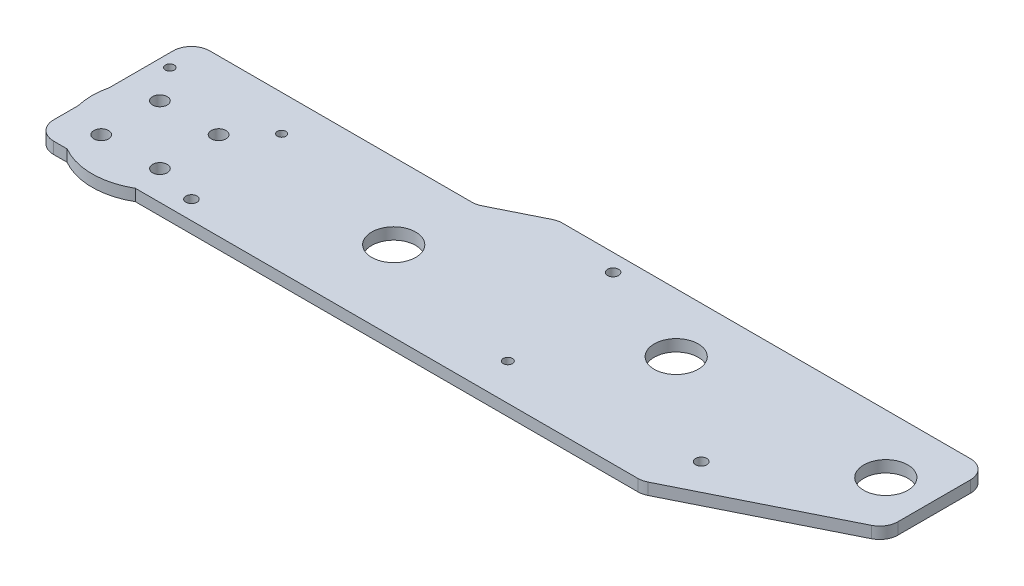
ISO-10303-21;
HEADER;
FILE_DESCRIPTION(('STEP AP214'),'2;1');
FILE_NAME('part.step','',(''),(''),'','','');
FILE_SCHEMA(('AUTOMOTIVE_DESIGN { 1 0 10303 214 1 1 1 1 }'));
ENDSEC;
DATA;
#1=APPLICATION_CONTEXT('core data for automotive mechanical design processes');
#2=APPLICATION_PROTOCOL_DEFINITION('international standard','automotive_design',2000,#1);
#3=PRODUCT_CONTEXT('',#1,'mechanical');
#4=PRODUCT('Part','Part','',(#3));
#5=PRODUCT_RELATED_PRODUCT_CATEGORY('part','',(#4));
#6=PRODUCT_DEFINITION_FORMATION('','',#4);
#7=PRODUCT_DEFINITION_CONTEXT('part definition',#1,'design');
#8=PRODUCT_DEFINITION('design','',#6,#7);
#9=PRODUCT_DEFINITION_SHAPE('','',#8);
#10=(LENGTH_UNIT() NAMED_UNIT(*) SI_UNIT(.MILLI.,.METRE.));
#11=(NAMED_UNIT(*) PLANE_ANGLE_UNIT() SI_UNIT($,.RADIAN.));
#12=(NAMED_UNIT(*) SI_UNIT($,.STERADIAN.) SOLID_ANGLE_UNIT());
#13=UNCERTAINTY_MEASURE_WITH_UNIT(LENGTH_MEASURE(1.E-05),#10,'distance_accuracy_value','');
#14=(GEOMETRIC_REPRESENTATION_CONTEXT(3) GLOBAL_UNCERTAINTY_ASSIGNED_CONTEXT((#13)) GLOBAL_UNIT_ASSIGNED_CONTEXT((#10,
#11,#12)) REPRESENTATION_CONTEXT('',''));
#15=CARTESIAN_POINT('',(0.,0.,0.));
#16=DIRECTION('',(0.,0.,1.));
#17=DIRECTION('',(1.,0.,0.));
#18=AXIS2_PLACEMENT_3D('',#15,#16,#17);
#19=CARTESIAN_POINT('',(0.,3.175,0.));
#20=DIRECTION('',(1.,0.,0.));
#21=DIRECTION('',(0.,0.,-1.));
#22=AXIS2_PLACEMENT_3D('',#19,#20,#21);
#23=PLANE('',#22);
#24=DIRECTION('',(0.,0.,1.));
#25=VECTOR('',#24,1.);
#26=CARTESIAN_POINT('',(0.,0.,0.));
#27=LINE('',#26,#25);
#28=CARTESIAN_POINT('',(0.,0.,12.4028120633884));
#29=VERTEX_POINT('',#28);
#30=CARTESIAN_POINT('',(0.,0.,29.7279981273413));
#31=VERTEX_POINT('',#30);
#32=EDGE_CURVE('E172',#29,#31,#27,.T.);
#33=ORIENTED_EDGE('',*,*,#32,.T.);
#34=DIRECTION('',(0.,1.,0.));
#35=VECTOR('',#34,1.);
#36=CARTESIAN_POINT('',(0.,0.,29.7279981273413));
#37=LINE('',#36,#35);
#38=CARTESIAN_POINT('',(0.,3.175,29.7279981273413));
#39=VERTEX_POINT('',#38);
#40=EDGE_CURVE('E159',#31,#39,#37,.T.);
#41=ORIENTED_EDGE('',*,*,#40,.T.);
#42=DIRECTION('',(0.,0.,1.));
#43=VECTOR('',#42,1.);
#44=CARTESIAN_POINT('',(0.,3.175,0.));
#45=LINE('',#44,#43);
#46=CARTESIAN_POINT('',(0.,3.175,12.4028120633884));
#47=VERTEX_POINT('',#46);
#48=EDGE_CURVE('E169',#47,#39,#45,.T.);
#49=ORIENTED_EDGE('',*,*,#48,.F.);
#50=DIRECTION('',(0.,1.,0.));
#51=VECTOR('',#50,1.);
#52=CARTESIAN_POINT('',(0.,3.175,12.4028120633884));
#53=LINE('',#52,#51);
#54=EDGE_CURVE('E251',#47,#29,#53,.F.);
#55=ORIENTED_EDGE('',*,*,#54,.T.);
#56=EDGE_LOOP('',(#33,#41,#49,#55));
#57=FACE_BOUND('',#56,.T.);
#58=ADVANCED_FACE('F35',(#57),#23,.F.);
#59=CARTESIAN_POINT('',(0.,3.175,50.));
#60=DIRECTION('',(0.,0.,-1.));
#61=DIRECTION('',(-1.,0.,0.));
#62=AXIS2_PLACEMENT_3D('',#59,#60,#61);
#63=PLANE('',#62);
#64=DIRECTION('',(1.,0.,0.));
#65=VECTOR('',#64,1.);
#66=CARTESIAN_POINT('',(0.,0.,50.));
#67=LINE('',#66,#65);
#68=CARTESIAN_POINT('',(5.00000000000001,0.,50.));
#69=VERTEX_POINT('',#68);
#70=CARTESIAN_POINT('',(8.71291218949668,0.,50.));
#71=VERTEX_POINT('',#70);
#72=EDGE_CURVE('E199',#69,#71,#67,.T.);
#73=ORIENTED_EDGE('',*,*,#72,.T.);
#74=DIRECTION('',(0.,1.,0.));
#75=VECTOR('',#74,1.);
#76=CARTESIAN_POINT('',(8.71291218949668,0.,50.));
#77=LINE('',#76,#75);
#78=CARTESIAN_POINT('',(8.71291218949668,3.175,50.));
#79=VERTEX_POINT('',#78);
#80=EDGE_CURVE('E11',#71,#79,#77,.T.);
#81=ORIENTED_EDGE('',*,*,#80,.T.);
#82=DIRECTION('',(1.,0.,0.));
#83=VECTOR('',#82,1.);
#84=CARTESIAN_POINT('',(0.,3.175,50.));
#85=LINE('',#84,#83);
#86=CARTESIAN_POINT('',(5.00000000000001,3.175,50.));
#87=VERTEX_POINT('',#86);
#88=EDGE_CURVE('E182',#87,#79,#85,.T.);
#89=ORIENTED_EDGE('',*,*,#88,.F.);
#90=DIRECTION('',(0.,-1.,0.));
#91=VECTOR('',#90,1.);
#92=CARTESIAN_POINT('',(5.00000000000001,3.175,50.));
#93=LINE('',#92,#91);
#94=EDGE_CURVE('E234',#87,#69,#93,.T.);
#95=ORIENTED_EDGE('',*,*,#94,.T.);
#96=EDGE_LOOP('',(#73,#81,#89,#95));
#97=FACE_BOUND('',#96,.T.);
#98=ADVANCED_FACE('F409',(#97),#63,.F.);
#99=CARTESIAN_POINT('',(0.,3.175,0.));
#100=DIRECTION('',(0.,1.,0.));
#101=DIRECTION('',(0.,0.,1.));
#102=AXIS2_PLACEMENT_3D('',#99,#100,#101);
#103=PLANE('',#102);
#104=ORIENTED_EDGE('',*,*,#88,.T.);
#105=CARTESIAN_POINT('',(18.,3.175,34.));
#106=DIRECTION('',(0.,1.,0.));
#107=DIRECTION('',(0.,0.,1.));
#108=AXIS2_PLACEMENT_3D('',#105,#106,#107);
#109=CIRCLE('',#108,18.5);
#110=CARTESIAN_POINT('',(27.2870878105033,3.175,50.));
#111=VERTEX_POINT('',#110);
#112=EDGE_CURVE('E57',#79,#111,#109,.T.);
#113=ORIENTED_EDGE('',*,*,#112,.T.);
#114=CARTESIAN_POINT('',(164.327666523127,3.175,50.));
#115=VERTEX_POINT('',#114);
#116=EDGE_CURVE('E179',#111,#115,#85,.T.);
#117=ORIENTED_EDGE('',*,*,#116,.T.);
#118=CARTESIAN_POINT('',(164.327666523127,3.175,45.));
#119=DIRECTION('',(0.,1.,0.));
#120=DIRECTION('',(0.,0.,1.));
#121=AXIS2_PLACEMENT_3D('',#118,#119,#120);
#122=CIRCLE('',#121,5.);
#123=CARTESIAN_POINT('',(166.555038564004,3.175,49.4764733654425));
#124=VERTEX_POINT('',#123);
#125=EDGE_CURVE('E256',#115,#124,#122,.T.);
#126=ORIENTED_EDGE('',*,*,#125,.T.);
#127=DIRECTION('',(-0.895294673088504,0.,0.445474408175541));
#128=VECTOR('',#127,1.);
#129=CARTESIAN_POINT('',(210.,3.175,27.8594359076578));
#130=LINE('',#129,#128);
#131=CARTESIAN_POINT('',(207.227372040878,3.175,29.2390205699011));
#132=VERTEX_POINT('',#131);
#133=EDGE_CURVE('E317',#132,#124,#130,.T.);
#134=ORIENTED_EDGE('',*,*,#133,.F.);
#135=CARTESIAN_POINT('',(205.,3.175,24.7625472044585));
#136=DIRECTION('',(0.,1.,0.));
#137=DIRECTION('',(0.,0.,1.));
#138=AXIS2_PLACEMENT_3D('',#135,#136,#137);
#139=CIRCLE('',#138,5.);
#140=CARTESIAN_POINT('',(210.,3.175,24.7625472044585));
#141=VERTEX_POINT('',#140);
#142=EDGE_CURVE('E258',#132,#141,#139,.T.);
#143=ORIENTED_EDGE('',*,*,#142,.T.);
#144=DIRECTION('',(0.,0.,-1.));
#145=VECTOR('',#144,1.);
#146=CARTESIAN_POINT('',(210.,3.175,0.));
#147=LINE('',#146,#145);
#148=CARTESIAN_POINT('',(210.,3.175,5.));
#149=VERTEX_POINT('',#148);
#150=EDGE_CURVE('E189',#141,#149,#147,.T.);
#151=ORIENTED_EDGE('',*,*,#150,.T.);
#152=CARTESIAN_POINT('',(205.,3.175,5.));
#153=DIRECTION('',(0.,1.,0.));
#154=DIRECTION('',(0.,0.,1.));
#155=AXIS2_PLACEMENT_3D('',#152,#153,#154);
#156=CIRCLE('',#155,5.);
#157=CARTESIAN_POINT('',(205.,3.175,0.));
#158=VERTEX_POINT('',#157);
#159=EDGE_CURVE('E260',#149,#158,#156,.T.);
#160=ORIENTED_EDGE('',*,*,#159,.T.);
#161=DIRECTION('',(-1.,0.,0.));
#162=VECTOR('',#161,1.);
#163=CARTESIAN_POINT('',(0.,3.175,0.));
#164=LINE('',#163,#162);
#165=CARTESIAN_POINT('',(93.707824868426,3.175,0.));
#166=VERTEX_POINT('',#165);
#167=EDGE_CURVE('E192',#158,#166,#164,.T.);
#168=ORIENTED_EDGE('',*,*,#167,.T.);
#169=CARTESIAN_POINT('',(93.707824868426,3.175,5.));
#170=DIRECTION('',(0.,1.,0.));
#171=DIRECTION('',(0.,0.,1.));
#172=AXIS2_PLACEMENT_3D('',#169,#170,#171);
#173=CIRCLE('',#172,5.);
#174=CARTESIAN_POINT('',(91.4804528275483,3.175,0.523526634557481));
#175=VERTEX_POINT('',#174);
#176=EDGE_CURVE('E262',#166,#175,#173,.T.);
#177=ORIENTED_EDGE('',*,*,#176,.T.);
#178=DIRECTION('',(0.895294673088504,0.,-0.445474408175541));
#179=VECTOR('',#178,1.);
#180=CARTESIAN_POINT('',(92.5326133973527,3.175,0.));
#181=LINE('',#180,#179);
#182=CARTESIAN_POINT('',(78.7069311896764,3.175,6.87928542883094));
#183=VERTEX_POINT('',#182);
#184=EDGE_CURVE('E323',#183,#175,#181,.T.);
#185=ORIENTED_EDGE('',*,*,#184,.F.);
#186=CARTESIAN_POINT('',(76.4795591487987,3.175,2.40281206338842));
#187=DIRECTION('',(0.,1.,0.));
#188=DIRECTION('',(0.,0.,1.));
#189=AXIS2_PLACEMENT_3D('',#186,#187,#188);
#190=CIRCLE('',#189,5.);
#191=CARTESIAN_POINT('',(76.4795591487987,3.175,7.40281206338842));
#192=VERTEX_POINT('',#191);
#193=EDGE_CURVE('E292',#183,#192,#190,.F.);
#194=ORIENTED_EDGE('',*,*,#193,.T.);
#195=DIRECTION('',(1.,0.,0.));
#196=VECTOR('',#195,1.);
#197=CARTESIAN_POINT('',(77.654770619872,3.175,7.40281206338842));
#198=LINE('',#197,#196);
#199=CARTESIAN_POINT('',(5.,3.175,7.40281206338842));
#200=VERTEX_POINT('',#199);
#201=EDGE_CURVE('E173',#200,#192,#198,.T.);
#202=ORIENTED_EDGE('',*,*,#201,.F.);
#203=CARTESIAN_POINT('',(5.,3.175,12.4028120633884));
#204=DIRECTION('',(0.,1.,0.));
#205=DIRECTION('',(0.,0.,1.));
#206=AXIS2_PLACEMENT_3D('',#203,#204,#205);
#207=CIRCLE('',#206,5.);
#208=EDGE_CURVE('E178',#200,#47,#207,.T.);
#209=ORIENTED_EDGE('',*,*,#208,.T.);
#210=ORIENTED_EDGE('',*,*,#48,.T.);
#211=CARTESIAN_POINT('',(0.,3.175,38.2720018726587));
#212=VERTEX_POINT('',#211);
#213=EDGE_CURVE('E50',#39,#212,#109,.T.);
#214=ORIENTED_EDGE('',*,*,#213,.T.);
#215=CARTESIAN_POINT('',(0.,3.175,45.));
#216=VERTEX_POINT('',#215);
#217=EDGE_CURVE('E180',#212,#216,#45,.T.);
#218=ORIENTED_EDGE('',*,*,#217,.T.);
#219=CARTESIAN_POINT('',(5.00000000000001,3.175,45.));
#220=DIRECTION('',(0.,1.,0.));
#221=DIRECTION('',(0.,0.,1.));
#222=AXIS2_PLACEMENT_3D('',#219,#220,#221);
#223=CIRCLE('',#222,5.);
#224=EDGE_CURVE('E265',#216,#87,#223,.T.);
#225=ORIENTED_EDGE('',*,*,#224,.T.);
#226=EDGE_LOOP('',(#104,#113,#117,#126,#134,#143,#151,#160,#168,#177,#185,#194,#202,#209,#210,
#214,#218,#225));
#227=FACE_BOUND('',#226,.T.);
#228=CARTESIAN_POINT('',(10.,3.175,26.));
#229=DIRECTION('',(0.,1.,0.));
#230=DIRECTION('',(0.,0.,1.));
#231=AXIS2_PLACEMENT_3D('',#228,#229,#230);
#232=CIRCLE('',#231,2.);
#233=CARTESIAN_POINT('',(10.,3.175,28.));
#234=VERTEX_POINT('',#233);
#235=EDGE_CURVE('E211',#234,#234,#232,.T.);
#236=ORIENTED_EDGE('',*,*,#235,.F.);
#237=EDGE_LOOP('',(#236));
#238=FACE_BOUND('',#237,.T.);
#239=CARTESIAN_POINT('',(26.,3.175,42.));
#240=DIRECTION('',(0.,1.,0.));
#241=DIRECTION('',(0.,0.,1.));
#242=AXIS2_PLACEMENT_3D('',#239,#240,#241);
#243=CIRCLE('',#242,2.);
#244=CARTESIAN_POINT('',(26.,3.175,44.));
#245=VERTEX_POINT('',#244);
#246=EDGE_CURVE('E231',#245,#245,#243,.T.);
#247=ORIENTED_EDGE('',*,*,#246,.F.);
#248=EDGE_LOOP('',(#247));
#249=FACE_BOUND('',#248,.T.);
#250=CARTESIAN_POINT('',(26.,3.175,26.));
#251=DIRECTION('',(0.,1.,0.));
#252=DIRECTION('',(0.,0.,1.));
#253=AXIS2_PLACEMENT_3D('',#250,#251,#252);
#254=CIRCLE('',#253,2.00000000000001);
#255=CARTESIAN_POINT('',(26.,3.175,28.));
#256=VERTEX_POINT('',#255);
#257=EDGE_CURVE('E347',#256,#256,#254,.T.);
#258=ORIENTED_EDGE('',*,*,#257,.F.);
#259=EDGE_LOOP('',(#258));
#260=FACE_BOUND('',#259,.T.);
#261=CARTESIAN_POINT('',(10.,3.175,42.));
#262=DIRECTION('',(0.,1.,0.));
#263=DIRECTION('',(0.,0.,1.));
#264=AXIS2_PLACEMENT_3D('',#261,#262,#263);
#265=CIRCLE('',#264,2.);
#266=CARTESIAN_POINT('',(10.,3.175,44.));
#267=VERTEX_POINT('',#266);
#268=EDGE_CURVE('E348',#267,#267,#265,.T.);
#269=ORIENTED_EDGE('',*,*,#268,.F.);
#270=EDGE_LOOP('',(#269));
#271=FACE_BOUND('',#270,.T.);
#272=CARTESIAN_POINT('',(140.771956051245,3.175,16.));
#273=DIRECTION('',(0.,1.,0.));
#274=DIRECTION('',(0.,0.,1.));
#275=AXIS2_PLACEMENT_3D('',#272,#273,#274);
#276=CIRCLE('',#275,6.00000000000002);
#277=CARTESIAN_POINT('',(140.771956051245,3.175,22.));
#278=VERTEX_POINT('',#277);
#279=EDGE_CURVE('E337',#278,#278,#276,.T.);
#280=ORIENTED_EDGE('',*,*,#279,.F.);
#281=EDGE_LOOP('',(#280));
#282=FACE_BOUND('',#281,.T.);
#283=CARTESIAN_POINT('',(197.921956051245,3.175,16.));
#284=DIRECTION('',(0.,1.,0.));
#285=DIRECTION('',(0.,0.,1.));
#286=AXIS2_PLACEMENT_3D('',#283,#284,#285);
#287=CIRCLE('',#286,6.00000000000002);
#288=CARTESIAN_POINT('',(197.921956051245,3.175,22.));
#289=VERTEX_POINT('',#288);
#290=EDGE_CURVE('E338',#289,#289,#287,.T.);
#291=ORIENTED_EDGE('',*,*,#290,.F.);
#292=EDGE_LOOP('',(#291));
#293=FACE_BOUND('',#292,.T.);
#294=CARTESIAN_POINT('',(75.8499135695119,3.175,28.1));
#295=DIRECTION('',(0.,1.,0.));
#296=DIRECTION('',(0.,0.,1.));
#297=AXIS2_PLACEMENT_3D('',#294,#295,#296);
#298=CIRCLE('',#297,6.);
#299=CARTESIAN_POINT('',(75.8499135695119,3.175,34.1));
#300=VERTEX_POINT('',#299);
#301=EDGE_CURVE('E225',#300,#300,#298,.T.);
#302=ORIENTED_EDGE('',*,*,#301,.F.);
#303=EDGE_LOOP('',(#302));
#304=FACE_BOUND('',#303,.T.);
#305=CARTESIAN_POINT('',(112.302052498536,3.175,4.73926011491407));
#306=DIRECTION('',(0.,1.,0.));
#307=DIRECTION('',(0.,0.,1.));
#308=AXIS2_PLACEMENT_3D('',#305,#306,#307);
#309=CIRCLE('',#308,1.50000000000013);
#310=CARTESIAN_POINT('',(112.302052498536,3.175,6.2392601149142));
#311=VERTEX_POINT('',#310);
#312=EDGE_CURVE('E361',#311,#311,#309,.T.);
#313=ORIENTED_EDGE('',*,*,#312,.F.);
#314=EDGE_LOOP('',(#313));
#315=FACE_BOUND('',#314,.T.);
#316=CARTESIAN_POINT('',(37.5207499584055,3.175,44.9211981208464));
#317=DIRECTION('',(0.,1.,0.));
#318=DIRECTION('',(0.,0.,1.));
#319=AXIS2_PLACEMENT_3D('',#316,#317,#318);
#320=CIRCLE('',#319,1.5);
#321=CARTESIAN_POINT('',(37.5207499584055,3.175,46.4211981208464));
#322=VERTEX_POINT('',#321);
#323=EDGE_CURVE('E373',#322,#322,#320,.T.);
#324=ORIENTED_EDGE('',*,*,#323,.F.);
#325=EDGE_LOOP('',(#324));
#326=FACE_BOUND('',#325,.T.);
#327=CARTESIAN_POINT('',(3.48952623297482,3.175,16.7876611117285));
#328=DIRECTION('',(0.,1.,0.));
#329=DIRECTION('',(0.,0.,1.));
#330=AXIS2_PLACEMENT_3D('',#327,#328,#329);
#331=CIRCLE('',#330,1.21166501811253);
#332=CARTESIAN_POINT('',(3.48952623297482,3.175,17.999326129841));
#333=VERTEX_POINT('',#332);
#334=EDGE_CURVE('E383',#333,#333,#331,.T.);
#335=ORIENTED_EDGE('',*,*,#334,.F.);
#336=EDGE_LOOP('',(#335));
#337=FACE_BOUND('',#336,.T.);
#338=CARTESIAN_POINT('',(34.3725877204713,3.175,17.1940052448511));
#339=DIRECTION('',(0.,1.,0.));
#340=DIRECTION('',(0.,0.,1.));
#341=AXIS2_PLACEMENT_3D('',#338,#339,#340);
#342=CIRCLE('',#341,1.16561711842174);
#343=CARTESIAN_POINT('',(34.3725877204713,3.175,18.3596223632728));
#344=VERTEX_POINT('',#343);
#345=EDGE_CURVE('E379',#344,#344,#342,.T.);
#346=ORIENTED_EDGE('',*,*,#345,.F.);
#347=EDGE_LOOP('',(#346));
#348=FACE_BOUND('',#347,.T.);
#349=CARTESIAN_POINT('',(118.879039361021,3.175,40.0176850426405));
#350=DIRECTION('',(0.,1.,0.));
#351=DIRECTION('',(0.,0.,1.));
#352=AXIS2_PLACEMENT_3D('',#349,#350,#351);
#353=CIRCLE('',#352,1.25);
#354=CARTESIAN_POINT('',(118.879039361021,3.175,41.2676850426405));
#355=VERTEX_POINT('',#354);
#356=EDGE_CURVE('E367',#355,#355,#353,.T.);
#357=ORIENTED_EDGE('',*,*,#356,.F.);
#358=EDGE_LOOP('',(#357));
#359=FACE_BOUND('',#358,.T.);
#360=CARTESIAN_POINT('',(168.975233936324,3.175,37.4032096333009));
#361=DIRECTION('',(0.,1.,0.));
#362=DIRECTION('',(0.,0.,1.));
#363=AXIS2_PLACEMENT_3D('',#360,#361,#362);
#364=CIRCLE('',#363,1.51727390455077);
#365=CARTESIAN_POINT('',(168.975233936324,3.175,38.9204835378516));
#366=VERTEX_POINT('',#365);
#367=EDGE_CURVE('E355',#366,#366,#364,.T.);
#368=ORIENTED_EDGE('',*,*,#367,.F.);
#369=EDGE_LOOP('',(#368));
#370=FACE_BOUND('',#369,.T.);
#371=ADVANCED_FACE('F175',(#227,#238,#249,#260,#271,#282,#293,#304,#315,#326,#337,#348,#359,
#370),#103,.T.);
#372=CARTESIAN_POINT('',(0.,0.,0.));
#373=DIRECTION('',(0.,1.,0.));
#374=DIRECTION('',(0.,0.,1.));
#375=AXIS2_PLACEMENT_3D('',#372,#373,#374);
#376=PLANE('',#375);
#377=CARTESIAN_POINT('',(0.,0.,38.2720018726587));
#378=VERTEX_POINT('',#377);
#379=CARTESIAN_POINT('',(0.,0.,45.));
#380=VERTEX_POINT('',#379);
#381=EDGE_CURVE('E198',#378,#380,#27,.T.);
#382=ORIENTED_EDGE('',*,*,#381,.F.);
#383=CARTESIAN_POINT('',(18.,0.,34.));
#384=DIRECTION('',(0.,1.,0.));
#385=DIRECTION('',(0.,0.,1.));
#386=AXIS2_PLACEMENT_3D('',#383,#384,#385);
#387=CIRCLE('',#386,18.5);
#388=EDGE_CURVE('E431',#31,#378,#387,.T.);
#389=ORIENTED_EDGE('',*,*,#388,.F.);
#390=ORIENTED_EDGE('',*,*,#32,.F.);
#391=CARTESIAN_POINT('',(5.,0.,12.4028120633884));
#392=DIRECTION('',(0.,1.,0.));
#393=DIRECTION('',(0.,0.,1.));
#394=AXIS2_PLACEMENT_3D('',#391,#392,#393);
#395=CIRCLE('',#394,5.);
#396=CARTESIAN_POINT('',(5.,0.,7.40281206338842));
#397=VERTEX_POINT('',#396);
#398=EDGE_CURVE('E246',#29,#397,#395,.F.);
#399=ORIENTED_EDGE('',*,*,#398,.T.);
#400=DIRECTION('',(1.,0.,0.));
#401=VECTOR('',#400,1.);
#402=CARTESIAN_POINT('',(0.,0.,7.40281206338842));
#403=LINE('',#402,#401);
#404=CARTESIAN_POINT('',(76.4795591487987,0.,7.40281206338842));
#405=VERTEX_POINT('',#404);
#406=EDGE_CURVE('E334',#397,#405,#403,.T.);
#407=ORIENTED_EDGE('',*,*,#406,.T.);
#408=CARTESIAN_POINT('',(76.4795591487987,0.,2.40281206338842));
#409=DIRECTION('',(0.,1.,0.));
#410=DIRECTION('',(0.,0.,1.));
#411=AXIS2_PLACEMENT_3D('',#408,#409,#410);
#412=CIRCLE('',#411,5.);
#413=CARTESIAN_POINT('',(78.7069311896765,0.,6.87928542883095));
#414=VERTEX_POINT('',#413);
#415=EDGE_CURVE('E294',#405,#414,#412,.T.);
#416=ORIENTED_EDGE('',*,*,#415,.T.);
#417=DIRECTION('',(0.895294673088504,0.,-0.445474408175541));
#418=VECTOR('',#417,1.);
#419=CARTESIAN_POINT('',(18.362861016876,0.,36.9048622083704));
#420=LINE('',#419,#418);
#421=CARTESIAN_POINT('',(91.4804528275483,0.,0.523526634557479));
#422=VERTEX_POINT('',#421);
#423=EDGE_CURVE('E322',#414,#422,#420,.T.);
#424=ORIENTED_EDGE('',*,*,#423,.T.);
#425=CARTESIAN_POINT('',(93.707824868426,0.,5.));
#426=DIRECTION('',(0.,1.,0.));
#427=DIRECTION('',(0.,0.,1.));
#428=AXIS2_PLACEMENT_3D('',#425,#426,#427);
#429=CIRCLE('',#428,5.);
#430=CARTESIAN_POINT('',(93.707824868426,0.,0.));
#431=VERTEX_POINT('',#430);
#432=EDGE_CURVE('E244',#422,#431,#429,.F.);
#433=ORIENTED_EDGE('',*,*,#432,.T.);
#434=DIRECTION('',(-1.,0.,0.));
#435=VECTOR('',#434,1.);
#436=CARTESIAN_POINT('',(0.,0.,0.));
#437=LINE('',#436,#435);
#438=CARTESIAN_POINT('',(205.,0.,0.));
#439=VERTEX_POINT('',#438);
#440=EDGE_CURVE('E184',#439,#431,#437,.T.);
#441=ORIENTED_EDGE('',*,*,#440,.F.);
#442=CARTESIAN_POINT('',(205.,0.,5.));
#443=DIRECTION('',(0.,1.,0.));
#444=DIRECTION('',(0.,0.,1.));
#445=AXIS2_PLACEMENT_3D('',#442,#443,#444);
#446=CIRCLE('',#445,5.);
#447=CARTESIAN_POINT('',(210.,0.,5.));
#448=VERTEX_POINT('',#447);
#449=EDGE_CURVE('E242',#439,#448,#446,.F.);
#450=ORIENTED_EDGE('',*,*,#449,.T.);
#451=DIRECTION('',(0.,0.,-1.));
#452=VECTOR('',#451,1.);
#453=CARTESIAN_POINT('',(210.,0.,0.));
#454=LINE('',#453,#452);
#455=CARTESIAN_POINT('',(210.,0.,24.7625472044585));
#456=VERTEX_POINT('',#455);
#457=EDGE_CURVE('E202',#456,#448,#454,.T.);
#458=ORIENTED_EDGE('',*,*,#457,.F.);
#459=CARTESIAN_POINT('',(205.,0.,24.7625472044585));
#460=DIRECTION('',(0.,1.,0.));
#461=DIRECTION('',(0.,0.,1.));
#462=AXIS2_PLACEMENT_3D('',#459,#460,#461);
#463=CIRCLE('',#462,5.);
#464=CARTESIAN_POINT('',(207.227372040878,0.,29.2390205699011));
#465=VERTEX_POINT('',#464);
#466=EDGE_CURVE('E240',#456,#465,#463,.F.);
#467=ORIENTED_EDGE('',*,*,#466,.T.);
#468=DIRECTION('',(-0.895294673088504,0.,0.445474408175541));
#469=VECTOR('',#468,1.);
#470=CARTESIAN_POINT('',(52.7851670626083,0.,106.085283513341));
#471=LINE('',#470,#469);
#472=CARTESIAN_POINT('',(166.555038564004,0.,49.4764733654425));
#473=VERTEX_POINT('',#472);
#474=EDGE_CURVE('E311',#465,#473,#471,.T.);
#475=ORIENTED_EDGE('',*,*,#474,.T.);
#476=CARTESIAN_POINT('',(164.327666523127,0.,45.));
#477=DIRECTION('',(0.,1.,0.));
#478=DIRECTION('',(0.,0.,1.));
#479=AXIS2_PLACEMENT_3D('',#476,#477,#478);
#480=CIRCLE('',#479,5.);
#481=CARTESIAN_POINT('',(164.327666523127,0.,50.));
#482=VERTEX_POINT('',#481);
#483=EDGE_CURVE('E237',#473,#482,#480,.F.);
#484=ORIENTED_EDGE('',*,*,#483,.T.);
#485=CARTESIAN_POINT('',(27.2870878105033,0.,50.));
#486=VERTEX_POINT('',#485);
#487=EDGE_CURVE('E197',#486,#482,#67,.T.);
#488=ORIENTED_EDGE('',*,*,#487,.F.);
#489=EDGE_CURVE('E164',#71,#486,#387,.T.);
#490=ORIENTED_EDGE('',*,*,#489,.F.);
#491=ORIENTED_EDGE('',*,*,#72,.F.);
#492=CARTESIAN_POINT('',(5.00000000000001,0.,45.));
#493=DIRECTION('',(0.,1.,0.));
#494=DIRECTION('',(0.,0.,1.));
#495=AXIS2_PLACEMENT_3D('',#492,#493,#494);
#496=CIRCLE('',#495,5.);
#497=EDGE_CURVE('E248',#69,#380,#496,.F.);
#498=ORIENTED_EDGE('',*,*,#497,.T.);
#499=EDGE_LOOP('',(#382,#389,#390,#399,#407,#416,#424,#433,#441,#450,#458,#467,#475,#484,#488,
#490,#491,#498));
#500=FACE_BOUND('',#499,.T.);
#501=CARTESIAN_POINT('',(10.,0.,42.));
#502=DIRECTION('',(0.,1.,0.));
#503=DIRECTION('',(0.,0.,1.));
#504=AXIS2_PLACEMENT_3D('',#501,#502,#503);
#505=CIRCLE('',#504,2.);
#506=CARTESIAN_POINT('',(10.,0.,44.));
#507=VERTEX_POINT('',#506);
#508=EDGE_CURVE('E217',#507,#507,#505,.T.);
#509=ORIENTED_EDGE('',*,*,#508,.T.);
#510=EDGE_LOOP('',(#509));
#511=FACE_BOUND('',#510,.T.);
#512=CARTESIAN_POINT('',(26.,0.,26.));
#513=DIRECTION('',(0.,1.,0.));
#514=DIRECTION('',(0.,0.,1.));
#515=AXIS2_PLACEMENT_3D('',#512,#513,#514);
#516=CIRCLE('',#515,2.00000000000001);
#517=CARTESIAN_POINT('',(26.,0.,28.));
#518=VERTEX_POINT('',#517);
#519=EDGE_CURVE('E214',#518,#518,#516,.T.);
#520=ORIENTED_EDGE('',*,*,#519,.T.);
#521=EDGE_LOOP('',(#520));
#522=FACE_BOUND('',#521,.T.);
#523=CARTESIAN_POINT('',(26.,0.,42.));
#524=DIRECTION('',(0.,1.,0.));
#525=DIRECTION('',(0.,0.,1.));
#526=AXIS2_PLACEMENT_3D('',#523,#524,#525);
#527=CIRCLE('',#526,2.);
#528=CARTESIAN_POINT('',(26.,0.,44.));
#529=VERTEX_POINT('',#528);
#530=EDGE_CURVE('E210',#529,#529,#527,.T.);
#531=ORIENTED_EDGE('',*,*,#530,.T.);
#532=EDGE_LOOP('',(#531));
#533=FACE_BOUND('',#532,.T.);
#534=CARTESIAN_POINT('',(10.,0.,26.));
#535=DIRECTION('',(0.,1.,0.));
#536=DIRECTION('',(0.,0.,1.));
#537=AXIS2_PLACEMENT_3D('',#534,#535,#536);
#538=CIRCLE('',#537,2.);
#539=CARTESIAN_POINT('',(10.,0.,28.));
#540=VERTEX_POINT('',#539);
#541=EDGE_CURVE('E207',#540,#540,#538,.T.);
#542=ORIENTED_EDGE('',*,*,#541,.T.);
#543=EDGE_LOOP('',(#542));
#544=FACE_BOUND('',#543,.T.);
#545=CARTESIAN_POINT('',(168.975233936324,0.,37.4032096333009));
#546=DIRECTION('',(0.,1.,0.));
#547=DIRECTION('',(0.,0.,1.));
#548=AXIS2_PLACEMENT_3D('',#545,#546,#547);
#549=CIRCLE('',#548,1.51727390455077);
#550=CARTESIAN_POINT('',(168.975233936324,0.,38.9204835378516));
#551=VERTEX_POINT('',#550);
#552=EDGE_CURVE('E220',#551,#551,#549,.T.);
#553=ORIENTED_EDGE('',*,*,#552,.T.);
#554=EDGE_LOOP('',(#553));
#555=FACE_BOUND('',#554,.T.);
#556=CARTESIAN_POINT('',(112.302052498536,0.,4.73926011491407));
#557=DIRECTION('',(0.,1.,0.));
#558=DIRECTION('',(0.,0.,1.));
#559=AXIS2_PLACEMENT_3D('',#556,#557,#558);
#560=CIRCLE('',#559,1.50000000000013);
#561=CARTESIAN_POINT('',(112.302052498536,0.,6.2392601149142));
#562=VERTEX_POINT('',#561);
#563=EDGE_CURVE('E358',#562,#562,#560,.T.);
#564=ORIENTED_EDGE('',*,*,#563,.T.);
#565=EDGE_LOOP('',(#564));
#566=FACE_BOUND('',#565,.T.);
#567=CARTESIAN_POINT('',(118.879039361021,0.,40.0176850426405));
#568=DIRECTION('',(0.,1.,0.));
#569=DIRECTION('',(0.,0.,1.));
#570=AXIS2_PLACEMENT_3D('',#567,#568,#569);
#571=CIRCLE('',#570,1.25);
#572=CARTESIAN_POINT('',(118.879039361021,0.,41.2676850426405));
#573=VERTEX_POINT('',#572);
#574=EDGE_CURVE('E364',#573,#573,#571,.T.);
#575=ORIENTED_EDGE('',*,*,#574,.T.);
#576=EDGE_LOOP('',(#575));
#577=FACE_BOUND('',#576,.T.);
#578=CARTESIAN_POINT('',(37.5207499584055,0.,44.9211981208464));
#579=DIRECTION('',(0.,1.,0.));
#580=DIRECTION('',(0.,0.,1.));
#581=AXIS2_PLACEMENT_3D('',#578,#579,#580);
#582=CIRCLE('',#581,1.5);
#583=CARTESIAN_POINT('',(37.5207499584055,0.,46.4211981208464));
#584=VERTEX_POINT('',#583);
#585=EDGE_CURVE('E370',#584,#584,#582,.T.);
#586=ORIENTED_EDGE('',*,*,#585,.T.);
#587=EDGE_LOOP('',(#586));
#588=FACE_BOUND('',#587,.T.);
#589=CARTESIAN_POINT('',(34.3725877204713,0.,17.1940052448511));
#590=DIRECTION('',(0.,1.,0.));
#591=DIRECTION('',(0.,0.,1.));
#592=AXIS2_PLACEMENT_3D('',#589,#590,#591);
#593=CIRCLE('',#592,1.16561711842174);
#594=CARTESIAN_POINT('',(34.3725877204713,0.,18.3596223632728));
#595=VERTEX_POINT('',#594);
#596=EDGE_CURVE('E376',#595,#595,#593,.T.);
#597=ORIENTED_EDGE('',*,*,#596,.T.);
#598=EDGE_LOOP('',(#597));
#599=FACE_BOUND('',#598,.T.);
#600=CARTESIAN_POINT('',(3.48952623297482,0.,16.7876611117285));
#601=DIRECTION('',(0.,1.,0.));
#602=DIRECTION('',(0.,0.,1.));
#603=AXIS2_PLACEMENT_3D('',#600,#601,#602);
#604=CIRCLE('',#603,1.21166501811253);
#605=CARTESIAN_POINT('',(3.48952623297482,0.,17.999326129841));
#606=VERTEX_POINT('',#605);
#607=EDGE_CURVE('E186',#606,#606,#604,.T.);
#608=ORIENTED_EDGE('',*,*,#607,.T.);
#609=EDGE_LOOP('',(#608));
#610=FACE_BOUND('',#609,.T.);
#611=CARTESIAN_POINT('',(75.8499135695119,0.,28.1));
#612=DIRECTION('',(0.,1.,0.));
#613=DIRECTION('',(0.,0.,1.));
#614=AXIS2_PLACEMENT_3D('',#611,#612,#613);
#615=CIRCLE('',#614,6.);
#616=CARTESIAN_POINT('',(75.8499135695119,0.,34.1));
#617=VERTEX_POINT('',#616);
#618=EDGE_CURVE('E221',#617,#617,#615,.T.);
#619=ORIENTED_EDGE('',*,*,#618,.T.);
#620=EDGE_LOOP('',(#619));
#621=FACE_BOUND('',#620,.T.);
#622=CARTESIAN_POINT('',(197.921956051245,0.,16.));
#623=DIRECTION('',(0.,1.,0.));
#624=DIRECTION('',(0.,0.,1.));
#625=AXIS2_PLACEMENT_3D('',#622,#623,#624);
#626=CIRCLE('',#625,6.00000000000002);
#627=CARTESIAN_POINT('',(197.921956051245,0.,22.));
#628=VERTEX_POINT('',#627);
#629=EDGE_CURVE('E224',#628,#628,#626,.T.);
#630=ORIENTED_EDGE('',*,*,#629,.T.);
#631=EDGE_LOOP('',(#630));
#632=FACE_BOUND('',#631,.T.);
#633=CARTESIAN_POINT('',(140.771956051245,0.,16.));
#634=DIRECTION('',(0.,1.,0.));
#635=DIRECTION('',(0.,0.,1.));
#636=AXIS2_PLACEMENT_3D('',#633,#634,#635);
#637=CIRCLE('',#636,6.00000000000002);
#638=CARTESIAN_POINT('',(140.771956051245,0.,22.));
#639=VERTEX_POINT('',#638);
#640=EDGE_CURVE('E228',#639,#639,#637,.T.);
#641=ORIENTED_EDGE('',*,*,#640,.T.);
#642=EDGE_LOOP('',(#641));
#643=FACE_BOUND('',#642,.T.);
#644=ADVANCED_FACE('F304',(#500,#511,#522,#533,#544,#555,#566,#577,#588,#599,#610,#621,#632,
#643),#376,.F.);
#645=ORIENTED_EDGE('',*,*,#217,.F.);
#646=DIRECTION('',(0.,1.,0.));
#647=VECTOR('',#646,1.);
#648=CARTESIAN_POINT('',(0.,0.,38.2720018726587));
#649=LINE('',#648,#647);
#650=EDGE_CURVE('E162',#212,#378,#649,.F.);
#651=ORIENTED_EDGE('',*,*,#650,.T.);
#652=ORIENTED_EDGE('',*,*,#381,.T.);
#653=DIRECTION('',(0.,-1.,0.));
#654=VECTOR('',#653,1.);
#655=CARTESIAN_POINT('',(0.,3.175,45.));
#656=LINE('',#655,#654);
#657=EDGE_CURVE('E253',#380,#216,#656,.F.);
#658=ORIENTED_EDGE('',*,*,#657,.T.);
#659=EDGE_LOOP('',(#645,#651,#652,#658));
#660=FACE_BOUND('',#659,.T.);
#661=ADVANCED_FACE('F411',(#660),#23,.F.);
#662=ORIENTED_EDGE('',*,*,#116,.F.);
#663=DIRECTION('',(0.,1.,0.));
#664=VECTOR('',#663,1.);
#665=CARTESIAN_POINT('',(27.2870878105033,0.,50.));
#666=LINE('',#665,#664);
#667=EDGE_CURVE('E43',#111,#486,#666,.F.);
#668=ORIENTED_EDGE('',*,*,#667,.T.);
#669=ORIENTED_EDGE('',*,*,#487,.T.);
#670=DIRECTION('',(0.,1.,0.));
#671=VECTOR('',#670,1.);
#672=CARTESIAN_POINT('',(164.327666523127,3.175,50.));
#673=LINE('',#672,#671);
#674=EDGE_CURVE('E195',#482,#115,#673,.T.);
#675=ORIENTED_EDGE('',*,*,#674,.T.);
#676=EDGE_LOOP('',(#662,#668,#669,#675));
#677=FACE_BOUND('',#676,.T.);
#678=ADVANCED_FACE('F299',(#677),#63,.F.);
#679=CARTESIAN_POINT('',(210.,3.175,0.));
#680=DIRECTION('',(-1.,0.,0.));
#681=DIRECTION('',(0.,0.,1.));
#682=AXIS2_PLACEMENT_3D('',#679,#680,#681);
#683=PLANE('',#682);
#684=ORIENTED_EDGE('',*,*,#457,.T.);
#685=DIRECTION('',(0.,-1.,0.));
#686=VECTOR('',#685,1.);
#687=CARTESIAN_POINT('',(210.,3.175,5.));
#688=LINE('',#687,#686);
#689=EDGE_CURVE('E286',#448,#149,#688,.F.);
#690=ORIENTED_EDGE('',*,*,#689,.T.);
#691=ORIENTED_EDGE('',*,*,#150,.F.);
#692=DIRECTION('',(0.,-1.,0.));
#693=VECTOR('',#692,1.);
#694=CARTESIAN_POINT('',(210.,3.175,24.7625472044585));
#695=LINE('',#694,#693);
#696=EDGE_CURVE('E283',#141,#456,#695,.T.);
#697=ORIENTED_EDGE('',*,*,#696,.T.);
#698=EDGE_LOOP('',(#684,#690,#691,#697));
#699=FACE_BOUND('',#698,.T.);
#700=ADVANCED_FACE('F404',(#699),#683,.F.);
#701=CARTESIAN_POINT('',(0.,3.175,0.));
#702=DIRECTION('',(0.,0.,1.));
#703=DIRECTION('',(1.,0.,0.));
#704=AXIS2_PLACEMENT_3D('',#701,#702,#703);
#705=PLANE('',#704);
#706=ORIENTED_EDGE('',*,*,#440,.T.);
#707=DIRECTION('',(0.,1.,0.));
#708=VECTOR('',#707,1.);
#709=CARTESIAN_POINT('',(93.707824868426,3.175,0.));
#710=LINE('',#709,#708);
#711=EDGE_CURVE('E280',#431,#166,#710,.T.);
#712=ORIENTED_EDGE('',*,*,#711,.T.);
#713=ORIENTED_EDGE('',*,*,#167,.F.);
#714=DIRECTION('',(0.,-1.,0.));
#715=VECTOR('',#714,1.);
#716=CARTESIAN_POINT('',(205.,3.175,0.));
#717=LINE('',#716,#715);
#718=EDGE_CURVE('E277',#158,#439,#717,.T.);
#719=ORIENTED_EDGE('',*,*,#718,.T.);
#720=EDGE_LOOP('',(#706,#712,#713,#719));
#721=FACE_BOUND('',#720,.T.);
#722=ADVANCED_FACE('F395',(#721),#705,.F.);
#723=CARTESIAN_POINT('',(3.48952623297482,3.175,16.7876611117285));
#724=DIRECTION('',(0.,-1.,0.));
#725=DIRECTION('',(0.,0.,-1.));
#726=AXIS2_PLACEMENT_3D('',#723,#724,#725);
#727=CYLINDRICAL_SURFACE('',#726,1.21166501811253);
#728=ORIENTED_EDGE('',*,*,#334,.T.);
#729=EDGE_LOOP('',(#728));
#730=FACE_BOUND('',#729,.T.);
#731=ORIENTED_EDGE('',*,*,#607,.F.);
#732=EDGE_LOOP('',(#731));
#733=FACE_BOUND('',#732,.T.);
#734=ADVANCED_FACE('F392',(#730,#733),#727,.F.);
#735=CARTESIAN_POINT('',(34.3725877204713,3.175,17.1940052448511));
#736=DIRECTION('',(0.,-1.,0.));
#737=DIRECTION('',(0.,0.,-1.));
#738=AXIS2_PLACEMENT_3D('',#735,#736,#737);
#739=CYLINDRICAL_SURFACE('',#738,1.16561711842174);
#740=ORIENTED_EDGE('',*,*,#345,.T.);
#741=EDGE_LOOP('',(#740));
#742=FACE_BOUND('',#741,.T.);
#743=ORIENTED_EDGE('',*,*,#596,.F.);
#744=EDGE_LOOP('',(#743));
#745=FACE_BOUND('',#744,.T.);
#746=ADVANCED_FACE('F394',(#742,#745),#739,.F.);
#747=CARTESIAN_POINT('',(37.5207499584055,3.175,44.9211981208464));
#748=DIRECTION('',(0.,-1.,0.));
#749=DIRECTION('',(0.,0.,-1.));
#750=AXIS2_PLACEMENT_3D('',#747,#748,#749);
#751=CYLINDRICAL_SURFACE('',#750,1.5);
#752=ORIENTED_EDGE('',*,*,#323,.T.);
#753=EDGE_LOOP('',(#752));
#754=FACE_BOUND('',#753,.T.);
#755=ORIENTED_EDGE('',*,*,#585,.F.);
#756=EDGE_LOOP('',(#755));
#757=FACE_BOUND('',#756,.T.);
#758=ADVANCED_FACE('F401',(#754,#757),#751,.F.);
#759=CARTESIAN_POINT('',(118.879039361021,3.175,40.0176850426405));
#760=DIRECTION('',(0.,-1.,0.));
#761=DIRECTION('',(0.,0.,-1.));
#762=AXIS2_PLACEMENT_3D('',#759,#760,#761);
#763=CYLINDRICAL_SURFACE('',#762,1.25);
#764=ORIENTED_EDGE('',*,*,#356,.T.);
#765=EDGE_LOOP('',(#764));
#766=FACE_BOUND('',#765,.T.);
#767=ORIENTED_EDGE('',*,*,#574,.F.);
#768=EDGE_LOOP('',(#767));
#769=FACE_BOUND('',#768,.T.);
#770=ADVANCED_FACE('F488',(#766,#769),#763,.F.);
#771=CARTESIAN_POINT('',(112.302052498536,3.175,4.73926011491407));
#772=DIRECTION('',(0.,-1.,0.));
#773=DIRECTION('',(0.,0.,-1.));
#774=AXIS2_PLACEMENT_3D('',#771,#772,#773);
#775=CYLINDRICAL_SURFACE('',#774,1.50000000000013);
#776=ORIENTED_EDGE('',*,*,#312,.T.);
#777=EDGE_LOOP('',(#776));
#778=FACE_BOUND('',#777,.T.);
#779=ORIENTED_EDGE('',*,*,#563,.F.);
#780=EDGE_LOOP('',(#779));
#781=FACE_BOUND('',#780,.T.);
#782=ADVANCED_FACE('F484',(#778,#781),#775,.F.);
#783=CARTESIAN_POINT('',(168.975233936324,3.175,37.4032096333009));
#784=DIRECTION('',(0.,-1.,0.));
#785=DIRECTION('',(0.,0.,-1.));
#786=AXIS2_PLACEMENT_3D('',#783,#784,#785);
#787=CYLINDRICAL_SURFACE('',#786,1.51727390455077);
#788=ORIENTED_EDGE('',*,*,#367,.T.);
#789=EDGE_LOOP('',(#788));
#790=FACE_BOUND('',#789,.T.);
#791=ORIENTED_EDGE('',*,*,#552,.F.);
#792=EDGE_LOOP('',(#791));
#793=FACE_BOUND('',#792,.T.);
#794=ADVANCED_FACE('F480',(#790,#793),#787,.F.);
#795=CARTESIAN_POINT('',(10.,-6.825,26.));
#796=DIRECTION('',(0.,1.,0.));
#797=DIRECTION('',(0.,0.,1.));
#798=AXIS2_PLACEMENT_3D('',#795,#796,#797);
#799=CYLINDRICAL_SURFACE('',#798,2.);
#800=ORIENTED_EDGE('',*,*,#235,.T.);
#801=EDGE_LOOP('',(#800));
#802=FACE_BOUND('',#801,.T.);
#803=ORIENTED_EDGE('',*,*,#541,.F.);
#804=EDGE_LOOP('',(#803));
#805=FACE_BOUND('',#804,.T.);
#806=ADVANCED_FACE('F470',(#802,#805),#799,.F.);
#807=CARTESIAN_POINT('',(26.,-6.825,42.));
#808=DIRECTION('',(0.,1.,0.));
#809=DIRECTION('',(0.,0.,1.));
#810=AXIS2_PLACEMENT_3D('',#807,#808,#809);
#811=CYLINDRICAL_SURFACE('',#810,2.);
#812=ORIENTED_EDGE('',*,*,#246,.T.);
#813=EDGE_LOOP('',(#812));
#814=FACE_BOUND('',#813,.T.);
#815=ORIENTED_EDGE('',*,*,#530,.F.);
#816=EDGE_LOOP('',(#815));
#817=FACE_BOUND('',#816,.T.);
#818=ADVANCED_FACE('F466',(#814,#817),#811,.F.);
#819=CARTESIAN_POINT('',(26.,-6.825,26.));
#820=DIRECTION('',(0.,1.,0.));
#821=DIRECTION('',(0.,0.,1.));
#822=AXIS2_PLACEMENT_3D('',#819,#820,#821);
#823=CYLINDRICAL_SURFACE('',#822,2.00000000000001);
#824=ORIENTED_EDGE('',*,*,#257,.T.);
#825=EDGE_LOOP('',(#824));
#826=FACE_BOUND('',#825,.T.);
#827=ORIENTED_EDGE('',*,*,#519,.F.);
#828=EDGE_LOOP('',(#827));
#829=FACE_BOUND('',#828,.T.);
#830=ADVANCED_FACE('F469',(#826,#829),#823,.F.);
#831=CARTESIAN_POINT('',(10.,-6.825,42.));
#832=DIRECTION('',(0.,1.,0.));
#833=DIRECTION('',(0.,0.,1.));
#834=AXIS2_PLACEMENT_3D('',#831,#832,#833);
#835=CYLINDRICAL_SURFACE('',#834,2.);
#836=ORIENTED_EDGE('',*,*,#268,.T.);
#837=EDGE_LOOP('',(#836));
#838=FACE_BOUND('',#837,.T.);
#839=ORIENTED_EDGE('',*,*,#508,.F.);
#840=EDGE_LOOP('',(#839));
#841=FACE_BOUND('',#840,.T.);
#842=ADVANCED_FACE('F464',(#838,#841),#835,.F.);
#843=CARTESIAN_POINT('',(75.8499135695119,-53.975,28.1));
#844=DIRECTION('',(0.,1.,0.));
#845=DIRECTION('',(0.,0.,1.));
#846=AXIS2_PLACEMENT_3D('',#843,#844,#845);
#847=CYLINDRICAL_SURFACE('',#846,6.);
#848=ORIENTED_EDGE('',*,*,#301,.T.);
#849=EDGE_LOOP('',(#848));
#850=FACE_BOUND('',#849,.T.);
#851=ORIENTED_EDGE('',*,*,#618,.F.);
#852=EDGE_LOOP('',(#851));
#853=FACE_BOUND('',#852,.T.);
#854=ADVANCED_FACE('F457',(#850,#853),#847,.F.);
#855=CARTESIAN_POINT('',(197.921956051245,-53.975,16.));
#856=DIRECTION('',(0.,1.,0.));
#857=DIRECTION('',(0.,0.,1.));
#858=AXIS2_PLACEMENT_3D('',#855,#856,#857);
#859=CYLINDRICAL_SURFACE('',#858,6.00000000000002);
#860=ORIENTED_EDGE('',*,*,#290,.T.);
#861=EDGE_LOOP('',(#860));
#862=FACE_BOUND('',#861,.T.);
#863=ORIENTED_EDGE('',*,*,#629,.F.);
#864=EDGE_LOOP('',(#863));
#865=FACE_BOUND('',#864,.T.);
#866=ADVANCED_FACE('F454',(#862,#865),#859,.F.);
#867=CARTESIAN_POINT('',(140.771956051245,-53.975,16.));
#868=DIRECTION('',(0.,1.,0.));
#869=DIRECTION('',(0.,0.,1.));
#870=AXIS2_PLACEMENT_3D('',#867,#868,#869);
#871=CYLINDRICAL_SURFACE('',#870,6.00000000000002);
#872=ORIENTED_EDGE('',*,*,#279,.T.);
#873=EDGE_LOOP('',(#872));
#874=FACE_BOUND('',#873,.T.);
#875=ORIENTED_EDGE('',*,*,#640,.F.);
#876=EDGE_LOOP('',(#875));
#877=FACE_BOUND('',#876,.T.);
#878=ADVANCED_FACE('F452',(#874,#877),#871,.F.);
#879=CARTESIAN_POINT('',(77.654770619872,-6.825,7.40281206338842));
#880=DIRECTION('',(0.,0.,1.));
#881=DIRECTION('',(1.,0.,0.));
#882=AXIS2_PLACEMENT_3D('',#879,#880,#881);
#883=PLANE('',#882);
#884=ORIENTED_EDGE('',*,*,#406,.F.);
#885=DIRECTION('',(0.,1.,0.));
#886=VECTOR('',#885,1.);
#887=CARTESIAN_POINT('',(5.,-6.825,7.40281206338842));
#888=LINE('',#887,#886);
#889=EDGE_CURVE('E269',#397,#200,#888,.T.);
#890=ORIENTED_EDGE('',*,*,#889,.T.);
#891=ORIENTED_EDGE('',*,*,#201,.T.);
#892=DIRECTION('',(0.,1.,0.));
#893=VECTOR('',#892,1.);
#894=CARTESIAN_POINT('',(76.4795591487987,0.,7.40281206338842));
#895=LINE('',#894,#893);
#896=EDGE_CURVE('E267',#192,#405,#895,.F.);
#897=ORIENTED_EDGE('',*,*,#896,.T.);
#898=EDGE_LOOP('',(#884,#890,#891,#897));
#899=FACE_BOUND('',#898,.T.);
#900=ADVANCED_FACE('F448',(#899),#883,.F.);
#901=CARTESIAN_POINT('',(92.5326133973527,-6.825,0.));
#902=DIRECTION('',(0.445474408175541,0.,0.895294673088504));
#903=DIRECTION('',(0.895294673088504,0.,-0.445474408175541));
#904=AXIS2_PLACEMENT_3D('',#901,#902,#903);
#905=PLANE('',#904);
#906=ORIENTED_EDGE('',*,*,#423,.F.);
#907=DIRECTION('',(0.,1.,0.));
#908=VECTOR('',#907,1.);
#909=CARTESIAN_POINT('',(78.7069311896764,3.175,6.87928542883094));
#910=LINE('',#909,#908);
#911=EDGE_CURVE('E274',#414,#183,#910,.T.);
#912=ORIENTED_EDGE('',*,*,#911,.T.);
#913=ORIENTED_EDGE('',*,*,#184,.T.);
#914=DIRECTION('',(0.,1.,0.));
#915=VECTOR('',#914,1.);
#916=CARTESIAN_POINT('',(91.4804528275483,-6.825,0.52352663455748));
#917=LINE('',#916,#915);
#918=EDGE_CURVE('E272',#175,#422,#917,.F.);
#919=ORIENTED_EDGE('',*,*,#918,.T.);
#920=EDGE_LOOP('',(#906,#912,#913,#919));
#921=FACE_BOUND('',#920,.T.);
#922=ADVANCED_FACE('F445',(#921),#905,.F.);
#923=CARTESIAN_POINT('',(210.,-6.825,27.8594359076578));
#924=DIRECTION('',(-0.445474408175541,0.,-0.895294673088504));
#925=DIRECTION('',(-0.895294673088504,0.,0.445474408175541));
#926=AXIS2_PLACEMENT_3D('',#923,#924,#925);
#927=PLANE('',#926);
#928=ORIENTED_EDGE('',*,*,#474,.F.);
#929=DIRECTION('',(0.,-1.,0.));
#930=VECTOR('',#929,1.);
#931=CARTESIAN_POINT('',(207.227372040878,-6.825,29.2390205699011));
#932=LINE('',#931,#930);
#933=EDGE_CURVE('E290',#465,#132,#932,.F.);
#934=ORIENTED_EDGE('',*,*,#933,.T.);
#935=ORIENTED_EDGE('',*,*,#133,.T.);
#936=DIRECTION('',(0.,1.,0.));
#937=VECTOR('',#936,1.);
#938=CARTESIAN_POINT('',(166.555038564004,-6.825,49.4764733654425));
#939=LINE('',#938,#937);
#940=EDGE_CURVE('E288',#124,#473,#939,.F.);
#941=ORIENTED_EDGE('',*,*,#940,.T.);
#942=EDGE_LOOP('',(#928,#934,#935,#941));
#943=FACE_BOUND('',#942,.T.);
#944=ADVANCED_FACE('F320',(#943),#927,.F.);
#945=CARTESIAN_POINT('',(5.00000000000001,3.175,45.));
#946=DIRECTION('',(0.,-1.,0.));
#947=DIRECTION('',(0.,0.,-1.));
#948=AXIS2_PLACEMENT_3D('',#945,#946,#947);
#949=CYLINDRICAL_SURFACE('',#948,5.);
#950=ORIENTED_EDGE('',*,*,#224,.F.);
#951=ORIENTED_EDGE('',*,*,#657,.F.);
#952=ORIENTED_EDGE('',*,*,#497,.F.);
#953=ORIENTED_EDGE('',*,*,#94,.F.);
#954=EDGE_LOOP('',(#950,#951,#952,#953));
#955=FACE_BOUND('',#954,.T.);
#956=ADVANCED_FACE('F430',(#955),#949,.T.);
#957=CARTESIAN_POINT('',(5.,-6.825,12.4028120633884));
#958=DIRECTION('',(0.,1.,0.));
#959=DIRECTION('',(0.,0.,1.));
#960=AXIS2_PLACEMENT_3D('',#957,#958,#959);
#961=CYLINDRICAL_SURFACE('',#960,5.);
#962=ORIENTED_EDGE('',*,*,#398,.F.);
#963=ORIENTED_EDGE('',*,*,#54,.F.);
#964=ORIENTED_EDGE('',*,*,#208,.F.);
#965=ORIENTED_EDGE('',*,*,#889,.F.);
#966=EDGE_LOOP('',(#962,#963,#964,#965));
#967=FACE_BOUND('',#966,.T.);
#968=ADVANCED_FACE('F554',(#967),#961,.T.);
#969=CARTESIAN_POINT('',(76.4795591487987,-6.825,2.40281206338842));
#970=DIRECTION('',(0.,-1.,0.));
#971=DIRECTION('',(0.,0.,-1.));
#972=AXIS2_PLACEMENT_3D('',#969,#970,#971);
#973=CYLINDRICAL_SURFACE('',#972,5.);
#974=ORIENTED_EDGE('',*,*,#415,.F.);
#975=ORIENTED_EDGE('',*,*,#896,.F.);
#976=ORIENTED_EDGE('',*,*,#193,.F.);
#977=ORIENTED_EDGE('',*,*,#911,.F.);
#978=EDGE_LOOP('',(#974,#975,#976,#977));
#979=FACE_BOUND('',#978,.T.);
#980=ADVANCED_FACE('F549',(#979),#973,.F.);
#981=CARTESIAN_POINT('',(93.707824868426,3.175,5.));
#982=DIRECTION('',(0.,1.,0.));
#983=DIRECTION('',(0.,0.,1.));
#984=AXIS2_PLACEMENT_3D('',#981,#982,#983);
#985=CYLINDRICAL_SURFACE('',#984,5.);
#986=ORIENTED_EDGE('',*,*,#432,.F.);
#987=ORIENTED_EDGE('',*,*,#918,.F.);
#988=ORIENTED_EDGE('',*,*,#176,.F.);
#989=ORIENTED_EDGE('',*,*,#711,.F.);
#990=EDGE_LOOP('',(#986,#987,#988,#989));
#991=FACE_BOUND('',#990,.T.);
#992=ADVANCED_FACE('F542',(#991),#985,.T.);
#993=CARTESIAN_POINT('',(205.,3.175,5.));
#994=DIRECTION('',(0.,-1.,0.));
#995=DIRECTION('',(0.,0.,-1.));
#996=AXIS2_PLACEMENT_3D('',#993,#994,#995);
#997=CYLINDRICAL_SURFACE('',#996,5.);
#998=ORIENTED_EDGE('',*,*,#159,.F.);
#999=ORIENTED_EDGE('',*,*,#689,.F.);
#1000=ORIENTED_EDGE('',*,*,#449,.F.);
#1001=ORIENTED_EDGE('',*,*,#718,.F.);
#1002=EDGE_LOOP('',(#998,#999,#1000,#1001));
#1003=FACE_BOUND('',#1002,.T.);
#1004=ADVANCED_FACE('F535',(#1003),#997,.T.);
#1005=CARTESIAN_POINT('',(205.,3.175,24.7625472044585));
#1006=DIRECTION('',(0.,-1.,0.));
#1007=DIRECTION('',(0.,0.,-1.));
#1008=AXIS2_PLACEMENT_3D('',#1005,#1006,#1007);
#1009=CYLINDRICAL_SURFACE('',#1008,5.);
#1010=ORIENTED_EDGE('',*,*,#142,.F.);
#1011=ORIENTED_EDGE('',*,*,#933,.F.);
#1012=ORIENTED_EDGE('',*,*,#466,.F.);
#1013=ORIENTED_EDGE('',*,*,#696,.F.);
#1014=EDGE_LOOP('',(#1010,#1011,#1012,#1013));
#1015=FACE_BOUND('',#1014,.T.);
#1016=ADVANCED_FACE('F441',(#1015),#1009,.T.);
#1017=CARTESIAN_POINT('',(164.327666523127,3.175,45.));
#1018=DIRECTION('',(0.,1.,0.));
#1019=DIRECTION('',(0.,0.,1.));
#1020=AXIS2_PLACEMENT_3D('',#1017,#1018,#1019);
#1021=CYLINDRICAL_SURFACE('',#1020,5.);
#1022=ORIENTED_EDGE('',*,*,#483,.F.);
#1023=ORIENTED_EDGE('',*,*,#940,.F.);
#1024=ORIENTED_EDGE('',*,*,#125,.F.);
#1025=ORIENTED_EDGE('',*,*,#674,.F.);
#1026=EDGE_LOOP('',(#1022,#1023,#1024,#1025));
#1027=FACE_BOUND('',#1026,.T.);
#1028=ADVANCED_FACE('F37',(#1027),#1021,.T.);
#1029=CARTESIAN_POINT('',(18.,0.,34.));
#1030=DIRECTION('',(0.,1.,0.));
#1031=DIRECTION('',(0.,0.,1.));
#1032=AXIS2_PLACEMENT_3D('',#1029,#1030,#1031);
#1033=CYLINDRICAL_SURFACE('',#1032,18.5);
#1034=ORIENTED_EDGE('',*,*,#80,.F.);
#1035=ORIENTED_EDGE('',*,*,#489,.T.);
#1036=ORIENTED_EDGE('',*,*,#667,.F.);
#1037=ORIENTED_EDGE('',*,*,#112,.F.);
#1038=EDGE_LOOP('',(#1034,#1035,#1036,#1037));
#1039=FACE_BOUND('',#1038,.T.);
#1040=ADVANCED_FACE('F434',(#1039),#1033,.T.);
#1041=ORIENTED_EDGE('',*,*,#40,.F.);
#1042=ORIENTED_EDGE('',*,*,#388,.T.);
#1043=ORIENTED_EDGE('',*,*,#650,.F.);
#1044=ORIENTED_EDGE('',*,*,#213,.F.);
#1045=EDGE_LOOP('',(#1041,#1042,#1043,#1044));
#1046=FACE_BOUND('',#1045,.T.);
#1047=ADVANCED_FACE('F158',(#1046),#1033,.T.);
#1048=CLOSED_SHELL('',(#58,#98,#371,#644,#661,#678,#700,#722,#734,#746,#758,#770,#782,#794,#806,
#818,#830,#842,#854,#866,#878,#900,#922,#944,#956,#968,#980,#992,#1004,#1016,#1028,#1040,#1047));
#1049=MANIFOLD_SOLID_BREP('B2',#1048);
#1050=ADVANCED_BREP_SHAPE_REPRESENTATION('',(#18,#1049),#14);
#1051=SHAPE_DEFINITION_REPRESENTATION(#9,#1050);
ENDSEC;
END-ISO-10303-21;
